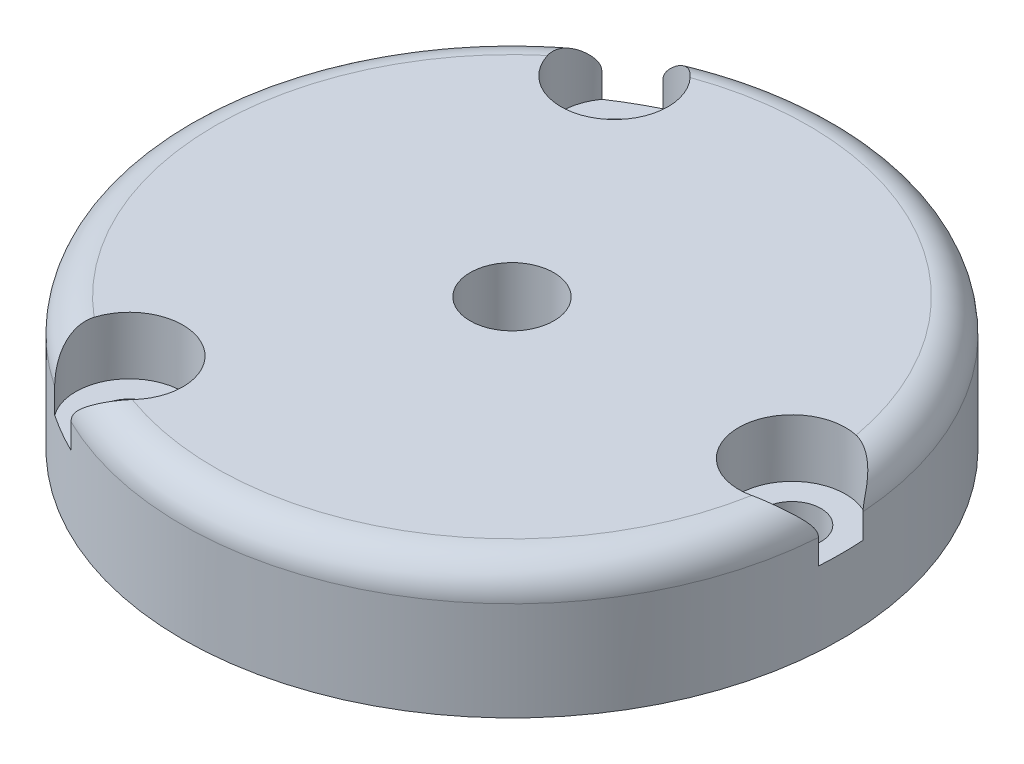
ISO-10303-21;
HEADER;
FILE_DESCRIPTION(('STEP AP214'),'2;1');
FILE_NAME('part.step','',(''),(''),'','','');
FILE_SCHEMA(('AUTOMOTIVE_DESIGN { 1 0 10303 214 1 1 1 1 }'));
ENDSEC;
DATA;
#1=APPLICATION_CONTEXT('core data for automotive mechanical design processes');
#2=APPLICATION_PROTOCOL_DEFINITION('international standard','automotive_design',2000,#1);
#3=PRODUCT_CONTEXT('',#1,'mechanical');
#4=PRODUCT('Part','Part','',(#3));
#5=PRODUCT_RELATED_PRODUCT_CATEGORY('part','',(#4));
#6=PRODUCT_DEFINITION_FORMATION('','',#4);
#7=PRODUCT_DEFINITION_CONTEXT('part definition',#1,'design');
#8=PRODUCT_DEFINITION('design','',#6,#7);
#9=PRODUCT_DEFINITION_SHAPE('','',#8);
#10=(LENGTH_UNIT() NAMED_UNIT(*) SI_UNIT(.MILLI.,.METRE.));
#11=(NAMED_UNIT(*) PLANE_ANGLE_UNIT() SI_UNIT($,.RADIAN.));
#12=(NAMED_UNIT(*) SI_UNIT($,.STERADIAN.) SOLID_ANGLE_UNIT());
#13=UNCERTAINTY_MEASURE_WITH_UNIT(LENGTH_MEASURE(1.E-05),#10,'distance_accuracy_value','');
#14=(GEOMETRIC_REPRESENTATION_CONTEXT(3) GLOBAL_UNCERTAINTY_ASSIGNED_CONTEXT((#13)) GLOBAL_UNIT_ASSIGNED_CONTEXT((#10,
#11,#12)) REPRESENTATION_CONTEXT('',''));
#15=CARTESIAN_POINT('',(0.,0.,0.));
#16=DIRECTION('',(0.,0.,1.));
#17=DIRECTION('',(1.,0.,0.));
#18=AXIS2_PLACEMENT_3D('',#15,#16,#17);
#19=CARTESIAN_POINT('',(17.,8.,0.));
#20=DIRECTION('',(0.,-1.,0.));
#21=DIRECTION('',(0.,0.,-1.));
#22=AXIS2_PLACEMENT_3D('',#19,#20,#21);
#23=CYLINDRICAL_SURFACE('',#22,1.75);
#24=CARTESIAN_POINT('',(17.,0.,0.));
#25=DIRECTION('',(0.,1.,0.));
#26=DIRECTION('',(0.,0.,1.));
#27=AXIS2_PLACEMENT_3D('',#24,#25,#26);
#28=CIRCLE('',#27,1.75);
#29=CARTESIAN_POINT('',(17.,0.,1.75));
#30=VERTEX_POINT('',#29);
#31=EDGE_CURVE('E157',#30,#30,#28,.T.);
#32=ORIENTED_EDGE('',*,*,#31,.F.);
#33=EDGE_LOOP('',(#32));
#34=FACE_BOUND('',#33,.T.);
#35=CARTESIAN_POINT('',(17.,4.5,0.));
#36=DIRECTION('',(0.,1.,0.));
#37=DIRECTION('',(0.,0.,1.));
#38=AXIS2_PLACEMENT_3D('',#35,#36,#37);
#39=CIRCLE('',#38,1.75);
#40=CARTESIAN_POINT('',(17.,4.5,1.75));
#41=VERTEX_POINT('',#40);
#42=EDGE_CURVE('E147',#41,#41,#39,.T.);
#43=ORIENTED_EDGE('',*,*,#42,.T.);
#44=EDGE_LOOP('',(#43));
#45=FACE_BOUND('',#44,.T.);
#46=ADVANCED_FACE('F37',(#34,#45),#23,.F.);
#47=CARTESIAN_POINT('',(-8.50000000000007,8.,14.7224318643354));
#48=DIRECTION('',(0.,-1.,0.));
#49=DIRECTION('',(0.,0.,-1.));
#50=AXIS2_PLACEMENT_3D('',#47,#48,#49);
#51=CYLINDRICAL_SURFACE('',#50,1.75);
#52=CARTESIAN_POINT('',(-8.50000000000007,0.,14.7224318643354));
#53=DIRECTION('',(0.,1.,0.));
#54=DIRECTION('',(0.,0.,1.));
#55=AXIS2_PLACEMENT_3D('',#52,#53,#54);
#56=CIRCLE('',#55,1.75);
#57=CARTESIAN_POINT('',(-8.50000000000007,0.,16.4724318643354));
#58=VERTEX_POINT('',#57);
#59=EDGE_CURVE('E154',#58,#58,#56,.T.);
#60=ORIENTED_EDGE('',*,*,#59,.F.);
#61=EDGE_LOOP('',(#60));
#62=FACE_BOUND('',#61,.T.);
#63=CARTESIAN_POINT('',(-8.50000000000007,4.5,14.7224318643354));
#64=DIRECTION('',(0.,1.,0.));
#65=DIRECTION('',(0.,0.,1.));
#66=AXIS2_PLACEMENT_3D('',#63,#64,#65);
#67=CIRCLE('',#66,1.75);
#68=CARTESIAN_POINT('',(-8.50000000000007,4.5,16.4724318643354));
#69=VERTEX_POINT('',#68);
#70=EDGE_CURVE('E130',#69,#69,#67,.T.);
#71=ORIENTED_EDGE('',*,*,#70,.T.);
#72=EDGE_LOOP('',(#71));
#73=FACE_BOUND('',#72,.T.);
#74=ADVANCED_FACE('F213',(#62,#73),#51,.F.);
#75=CARTESIAN_POINT('',(-8.49999999999986,8.,-14.7224318643355));
#76=DIRECTION('',(0.,-1.,0.));
#77=DIRECTION('',(0.,0.,-1.));
#78=AXIS2_PLACEMENT_3D('',#75,#76,#77);
#79=CYLINDRICAL_SURFACE('',#78,1.75);
#80=CARTESIAN_POINT('',(-8.49999999999986,0.,-14.7224318643355));
#81=DIRECTION('',(0.,1.,0.));
#82=DIRECTION('',(0.,0.,1.));
#83=AXIS2_PLACEMENT_3D('',#80,#81,#82);
#84=CIRCLE('',#83,1.75);
#85=CARTESIAN_POINT('',(-8.49999999999986,0.,-12.9724318643355));
#86=VERTEX_POINT('',#85);
#87=EDGE_CURVE('E151',#86,#86,#84,.T.);
#88=ORIENTED_EDGE('',*,*,#87,.F.);
#89=EDGE_LOOP('',(#88));
#90=FACE_BOUND('',#89,.T.);
#91=CARTESIAN_POINT('',(-8.49999999999986,4.5,-14.7224318643355));
#92=DIRECTION('',(0.,1.,0.));
#93=DIRECTION('',(0.,0.,1.));
#94=AXIS2_PLACEMENT_3D('',#91,#92,#93);
#95=CIRCLE('',#94,1.75);
#96=CARTESIAN_POINT('',(-8.49999999999986,4.5,-12.9724318643355));
#97=VERTEX_POINT('',#96);
#98=EDGE_CURVE('E131',#97,#97,#95,.T.);
#99=ORIENTED_EDGE('',*,*,#98,.T.);
#100=EDGE_LOOP('',(#99));
#101=FACE_BOUND('',#100,.T.);
#102=ADVANCED_FACE('F208',(#90,#101),#79,.F.);
#103=CARTESIAN_POINT('',(0.,8.,0.));
#104=DIRECTION('',(0.,1.,0.));
#105=DIRECTION('',(0.,0.,1.));
#106=AXIS2_PLACEMENT_3D('',#103,#104,#105);
#107=PLANE('',#106);
#108=CARTESIAN_POINT('',(0.,8.,0.));
#109=DIRECTION('',(0.,1.,0.));
#110=DIRECTION('',(0.,0.,1.));
#111=AXIS2_PLACEMENT_3D('',#108,#109,#110);
#112=CIRCLE('',#111,2.54000508001016);
#113=CARTESIAN_POINT('',(0.,8.,2.54000508001016));
#114=VERTEX_POINT('',#113);
#115=EDGE_CURVE('E294',#114,#114,#112,.T.);
#116=ORIENTED_EDGE('',*,*,#115,.F.);
#117=EDGE_LOOP('',(#116));
#118=FACE_BOUND('',#117,.T.);
#119=CARTESIAN_POINT('',(17.,8.,0.));
#120=DIRECTION('',(0.,1.,0.));
#121=DIRECTION('',(0.,0.,1.));
#122=AXIS2_PLACEMENT_3D('',#119,#120,#121);
#123=CIRCLE('',#122,3.25);
#124=CARTESIAN_POINT('',(17.71875,8.,-3.16952653207068));
#125=VERTEX_POINT('',#124);
#126=CARTESIAN_POINT('',(17.71875,8.,3.16952653207068));
#127=VERTEX_POINT('',#126);
#128=EDGE_CURVE('E289',#125,#127,#123,.T.);
#129=ORIENTED_EDGE('',*,*,#128,.F.);
#130=CARTESIAN_POINT('',(0.,8.,0.));
#131=DIRECTION('',(0.,1.,0.));
#132=DIRECTION('',(0.,0.,1.));
#133=AXIS2_PLACEMENT_3D('',#130,#131,#132);
#134=CIRCLE('',#133,18.);
#135=CARTESIAN_POINT('',(-6.11448450525784,8.,-16.9296508893409));
#136=VERTEX_POINT('',#135);
#137=EDGE_CURVE('E185',#125,#136,#134,.T.);
#138=ORIENTED_EDGE('',*,*,#137,.T.);
#139=CARTESIAN_POINT('',(-8.49999999999986,8.,-14.7224318643355));
#140=DIRECTION('',(0.,1.,0.));
#141=DIRECTION('',(0.,0.,1.));
#142=AXIS2_PLACEMENT_3D('',#139,#140,#141);
#143=CIRCLE('',#142,3.25);
#144=CARTESIAN_POINT('',(-11.6042654947419,8.,-13.7601243572703));
#145=VERTEX_POINT('',#144);
#146=EDGE_CURVE('E136',#145,#136,#143,.T.);
#147=ORIENTED_EDGE('',*,*,#146,.F.);
#148=CARTESIAN_POINT('',(0.,8.,0.));
#149=DIRECTION('',(0.,1.,0.));
#150=DIRECTION('',(0.,0.,1.));
#151=AXIS2_PLACEMENT_3D('',#148,#149,#150);
#152=CIRCLE('',#151,18.);
#153=CARTESIAN_POINT('',(-11.6042654947421,8.,13.7601243572701));
#154=VERTEX_POINT('',#153);
#155=EDGE_CURVE('E182',#145,#154,#152,.T.);
#156=ORIENTED_EDGE('',*,*,#155,.T.);
#157=CARTESIAN_POINT('',(-8.50000000000007,8.,14.7224318643354));
#158=DIRECTION('',(0.,1.,0.));
#159=DIRECTION('',(0.,0.,1.));
#160=AXIS2_PLACEMENT_3D('',#157,#158,#159);
#161=CIRCLE('',#160,3.25);
#162=CARTESIAN_POINT('',(-6.11448450525807,8.,16.9296508893408));
#163=VERTEX_POINT('',#162);
#164=EDGE_CURVE('E135',#163,#154,#161,.T.);
#165=ORIENTED_EDGE('',*,*,#164,.F.);
#166=CARTESIAN_POINT('',(0.,8.,0.));
#167=DIRECTION('',(0.,1.,0.));
#168=DIRECTION('',(0.,0.,1.));
#169=AXIS2_PLACEMENT_3D('',#166,#167,#168);
#170=CIRCLE('',#169,18.);
#171=EDGE_CURVE('E179',#163,#127,#170,.T.);
#172=ORIENTED_EDGE('',*,*,#171,.T.);
#173=EDGE_LOOP('',(#129,#138,#147,#156,#165,#172));
#174=FACE_BOUND('',#173,.T.);
#175=ADVANCED_FACE('F212',(#118,#174),#107,.T.);
#176=CARTESIAN_POINT('',(0.,0.,0.));
#177=DIRECTION('',(0.,1.,0.));
#178=DIRECTION('',(0.,0.,1.));
#179=AXIS2_PLACEMENT_3D('',#176,#177,#178);
#180=PLANE('',#179);
#181=CARTESIAN_POINT('',(0.,0.,0.));
#182=DIRECTION('',(0.,1.,0.));
#183=DIRECTION('',(0.,0.,1.));
#184=AXIS2_PLACEMENT_3D('',#181,#182,#183);
#185=CIRCLE('',#184,2.54000508001016);
#186=CARTESIAN_POINT('',(0.,0.,2.54000508001016));
#187=VERTEX_POINT('',#186);
#188=EDGE_CURVE('E140',#187,#187,#185,.T.);
#189=ORIENTED_EDGE('',*,*,#188,.T.);
#190=EDGE_LOOP('',(#189));
#191=FACE_BOUND('',#190,.T.);
#192=CARTESIAN_POINT('',(0.,0.,0.));
#193=DIRECTION('',(0.,1.,0.));
#194=DIRECTION('',(0.,0.,1.));
#195=AXIS2_PLACEMENT_3D('',#192,#193,#194);
#196=CIRCLE('',#195,20.);
#197=CARTESIAN_POINT('',(0.,0.,20.));
#198=VERTEX_POINT('',#197);
#199=EDGE_CURVE('E124',#198,#198,#196,.T.);
#200=ORIENTED_EDGE('',*,*,#199,.F.);
#201=EDGE_LOOP('',(#200));
#202=FACE_BOUND('',#201,.T.);
#203=ORIENTED_EDGE('',*,*,#31,.T.);
#204=EDGE_LOOP('',(#203));
#205=FACE_BOUND('',#204,.T.);
#206=ORIENTED_EDGE('',*,*,#59,.T.);
#207=EDGE_LOOP('',(#206));
#208=FACE_BOUND('',#207,.T.);
#209=ORIENTED_EDGE('',*,*,#87,.T.);
#210=EDGE_LOOP('',(#209));
#211=FACE_BOUND('',#210,.T.);
#212=ADVANCED_FACE('F223',(#191,#202,#205,#208,#211),#180,.F.);
#213=CARTESIAN_POINT('',(0.,8.,0.));
#214=DIRECTION('',(0.,-1.,0.));
#215=DIRECTION('',(0.,0.,-1.));
#216=AXIS2_PLACEMENT_3D('',#213,#214,#215);
#217=CYLINDRICAL_SURFACE('',#216,20.);
#218=DIRECTION('',(0.,1.,0.));
#219=VECTOR('',#218,1.);
#220=CARTESIAN_POINT('',(-8.80352620742625,6.25,-17.9582272598149));
#221=LINE('',#220,#219);
#222=CARTESIAN_POINT('',(-8.80352620742629,4.5,-17.9582272598149));
#223=VERTEX_POINT('',#222);
#224=CARTESIAN_POINT('',(-8.80352620742625,6.,-17.9582272598149));
#225=VERTEX_POINT('',#224);
#226=EDGE_CURVE('E123',#223,#225,#221,.T.);
#227=ORIENTED_EDGE('',*,*,#226,.T.);
#228=CARTESIAN_POINT('',(0.,6.,0.));
#229=DIRECTION('',(0.,1.,0.));
#230=DIRECTION('',(0.,0.,1.));
#231=AXIS2_PLACEMENT_3D('',#228,#229,#230);
#232=CIRCLE('',#231,20.);
#233=CARTESIAN_POINT('',(19.9540441176471,6.,-1.355036291394));
#234=VERTEX_POINT('',#233);
#235=EDGE_CURVE('E58',#225,#234,#232,.F.);
#236=ORIENTED_EDGE('',*,*,#235,.T.);
#237=DIRECTION('',(0.,1.,0.));
#238=VECTOR('',#237,1.);
#239=CARTESIAN_POINT('',(19.9540441176471,6.25,-1.355036291394));
#240=LINE('',#239,#238);
#241=CARTESIAN_POINT('',(19.9540441176471,4.5,-1.355036291394));
#242=VERTEX_POINT('',#241);
#243=EDGE_CURVE('E174',#234,#242,#240,.F.);
#244=ORIENTED_EDGE('',*,*,#243,.T.);
#245=CARTESIAN_POINT('',(0.,4.5,0.));
#246=DIRECTION('',(0.,1.,0.));
#247=DIRECTION('',(0.,0.,1.));
#248=AXIS2_PLACEMENT_3D('',#245,#246,#247);
#249=CIRCLE('',#248,20.);
#250=CARTESIAN_POINT('',(19.9540441176471,4.5,1.355036291394));
#251=VERTEX_POINT('',#250);
#252=EDGE_CURVE('E148',#251,#242,#249,.T.);
#253=ORIENTED_EDGE('',*,*,#252,.F.);
#254=DIRECTION('',(0.,1.,0.));
#255=VECTOR('',#254,1.);
#256=CARTESIAN_POINT('',(19.9540441176471,6.25,1.355036291394));
#257=LINE('',#256,#255);
#258=CARTESIAN_POINT('',(19.9540441176471,6.,1.355036291394));
#259=VERTEX_POINT('',#258);
#260=EDGE_CURVE('E176',#251,#259,#257,.T.);
#261=ORIENTED_EDGE('',*,*,#260,.T.);
#262=CARTESIAN_POINT('',(0.,6.,0.));
#263=DIRECTION('',(0.,1.,0.));
#264=DIRECTION('',(0.,0.,1.));
#265=AXIS2_PLACEMENT_3D('',#262,#263,#264);
#266=CIRCLE('',#265,20.);
#267=CARTESIAN_POINT('',(-8.8035262074265,6.,17.9582272598148));
#268=VERTEX_POINT('',#267);
#269=EDGE_CURVE('E284',#259,#268,#266,.F.);
#270=ORIENTED_EDGE('',*,*,#269,.T.);
#271=DIRECTION('',(0.,1.,0.));
#272=VECTOR('',#271,1.);
#273=CARTESIAN_POINT('',(-8.8035262074265,6.25,17.9582272598148));
#274=LINE('',#273,#272);
#275=CARTESIAN_POINT('',(-8.80352620742653,4.5,17.9582272598148));
#276=VERTEX_POINT('',#275);
#277=EDGE_CURVE('E170',#268,#276,#274,.F.);
#278=ORIENTED_EDGE('',*,*,#277,.T.);
#279=CARTESIAN_POINT('',(0.,4.5,0.));
#280=DIRECTION('',(0.,1.,0.));
#281=DIRECTION('',(0.,0.,1.));
#282=AXIS2_PLACEMENT_3D('',#279,#280,#281);
#283=CIRCLE('',#282,20.);
#284=CARTESIAN_POINT('',(-11.1505179102207,4.5,16.6031909684207));
#285=VERTEX_POINT('',#284);
#286=EDGE_CURVE('E144',#285,#276,#283,.T.);
#287=ORIENTED_EDGE('',*,*,#286,.F.);
#288=DIRECTION('',(0.,1.,0.));
#289=VECTOR('',#288,1.);
#290=CARTESIAN_POINT('',(-11.1505179102207,6.25,16.6031909684207));
#291=LINE('',#290,#289);
#292=CARTESIAN_POINT('',(-11.1505179102207,6.,16.6031909684207));
#293=VERTEX_POINT('',#292);
#294=EDGE_CURVE('E172',#285,#293,#291,.T.);
#295=ORIENTED_EDGE('',*,*,#294,.T.);
#296=CARTESIAN_POINT('',(0.,6.,0.));
#297=DIRECTION('',(0.,1.,0.));
#298=DIRECTION('',(0.,0.,1.));
#299=AXIS2_PLACEMENT_3D('',#296,#297,#298);
#300=CIRCLE('',#299,20.);
#301=CARTESIAN_POINT('',(-11.1505179102205,6.,-16.6031909684209));
#302=VERTEX_POINT('',#301);
#303=EDGE_CURVE('E119',#293,#302,#300,.F.);
#304=ORIENTED_EDGE('',*,*,#303,.T.);
#305=DIRECTION('',(0.,1.,0.));
#306=VECTOR('',#305,1.);
#307=CARTESIAN_POINT('',(-11.1505179102205,6.25,-16.6031909684209));
#308=LINE('',#307,#306);
#309=CARTESIAN_POINT('',(-11.1505179102204,4.5,-16.6031909684209));
#310=VERTEX_POINT('',#309);
#311=EDGE_CURVE('E113',#302,#310,#308,.F.);
#312=ORIENTED_EDGE('',*,*,#311,.T.);
#313=CARTESIAN_POINT('',(0.,4.5,0.));
#314=DIRECTION('',(0.,1.,0.));
#315=DIRECTION('',(0.,0.,1.));
#316=AXIS2_PLACEMENT_3D('',#313,#314,#315);
#317=CIRCLE('',#316,20.);
#318=EDGE_CURVE('E117',#223,#310,#317,.T.);
#319=ORIENTED_EDGE('',*,*,#318,.F.);
#320=EDGE_LOOP('',(#227,#236,#244,#253,#261,#270,#278,#287,#295,#304,#312,#319));
#321=FACE_BOUND('',#320,.T.);
#322=ORIENTED_EDGE('',*,*,#199,.T.);
#323=EDGE_LOOP('',(#322));
#324=FACE_BOUND('',#323,.T.);
#325=ADVANCED_FACE('F115',(#321,#324),#217,.T.);
#326=CARTESIAN_POINT('',(-8.49999999999986,4.5,-14.7224318643355));
#327=DIRECTION('',(0.,1.,0.));
#328=DIRECTION('',(0.,0.,1.));
#329=AXIS2_PLACEMENT_3D('',#326,#327,#328);
#330=CYLINDRICAL_SURFACE('',#329,3.25);
#331=ORIENTED_EDGE('',*,*,#146,.T.);
#332=CARTESIAN_POINT('',(-6.11448450525784,8.,-16.9296508893409));
#333=CARTESIAN_POINT('',(-6.15699882348261,8.00000484261255,-16.9756200424879));
#334=CARTESIAN_POINT('',(-6.20083787973819,7.99750590883581,-17.0203162114791));
#335=CARTESIAN_POINT('',(-6.290693527046,7.98789505230279,-17.106823781387));
#336=CARTESIAN_POINT('',(-6.33670721054258,7.98078913604264,-17.1486388601942));
#337=CARTESIAN_POINT('',(-6.43011653692011,7.96244258226751,-17.2287920518186));
#338=CARTESIAN_POINT('',(-6.47749534588452,7.95124101600859,-17.2671588862103));
#339=CARTESIAN_POINT('',(-6.57366437807587,7.92507757002663,-17.3407137013072));
#340=CARTESIAN_POINT('',(-6.62245504937324,7.91011448470045,-17.3759006579058));
#341=CARTESIAN_POINT('',(-6.76986429717374,7.86031380418753,-17.4761890982992));
#342=CARTESIAN_POINT('',(-6.87009422901719,7.82044463271987,-17.5365054921736));
#343=CARTESIAN_POINT('',(-7.0727032534655,7.72958423597335,-17.6445166335825));
#344=CARTESIAN_POINT('',(-7.17508910738692,7.67855099576568,-17.6921621526548));
#345=CARTESIAN_POINT('',(-7.35316086373035,7.58168484201379,-17.7644625216368));
#346=CARTESIAN_POINT('',(-7.42888773825527,7.53793337774414,-17.7918754476863));
#347=CARTESIAN_POINT('',(-7.57955524611685,7.44581092366916,-17.8403706559995));
#348=CARTESIAN_POINT('',(-7.65449585724778,7.39743980378281,-17.8614527599294));
#349=CARTESIAN_POINT('',(-7.8026673059529,7.29642967362192,-17.8976531659144));
#350=CARTESIAN_POINT('',(-7.87590148805815,7.24380011110484,-17.9127842559254));
#351=CARTESIAN_POINT('',(-8.01990922956972,7.13415495655745,-17.9376056835353));
#352=CARTESIAN_POINT('',(-8.09068420457608,7.07714195060971,-17.9472992015326));
#353=CARTESIAN_POINT('',(-8.22247737594965,6.96352378508904,-17.9611773741577));
#354=CARTESIAN_POINT('',(-8.28380489145138,6.9073284709651,-17.9657734058851));
#355=CARTESIAN_POINT('',(-8.40219794447938,6.78985326947604,-17.9715017221832));
#356=CARTESIAN_POINT('',(-8.45924284226875,6.72855143146289,-17.9726181674804));
#357=CARTESIAN_POINT('',(-8.56703104626147,6.59864446116617,-17.9721924772886));
#358=CARTESIAN_POINT('',(-8.61764096106961,6.52992683151221,-17.9706016480474));
#359=CARTESIAN_POINT('',(-8.70503882234152,6.38476159979072,-17.9662477762792));
#360=CARTESIAN_POINT('',(-8.74200673219111,6.30843287434533,-17.9635011015706));
#361=CARTESIAN_POINT('',(-8.77875950046583,6.1916964543393,-17.9604786249124));
#362=CARTESIAN_POINT('',(-8.78783443182771,6.15429498707123,-17.9596710576745));
#363=CARTESIAN_POINT('',(-8.80031467585149,6.07798407088327,-17.958528734799));
#364=CARTESIAN_POINT('',(-8.8036314203065,6.03906032366693,-17.9582013770164));
#365=CARTESIAN_POINT('',(-8.8035262074263,6.00000000000001,-17.9582272598149));
#366=B_SPLINE_CURVE_WITH_KNOTS('',3,(#332,#333,#334,#335,#336,#337,#338,#339,#340,#341,#342,
#343,#344,#345,#346,#347,#348,#349,#350,#351,#352,#353,#354,#355,#356,#357,#358,#359,#360,#361,
#362,#363,#364,#365),.UNSPECIFIED.,.F.,.F.,(4,2,2,2,2,2,2,2,2,2,2,2,2,2,2,2,4),(0.,
0.187716893140828,0.375189535404724,0.560918516995513,0.746707102581722,1.11602247485986,
1.48675240353006,1.76137650659081,2.03600834484391,2.31004676767369,2.58392473975247,
2.83358149478124,3.08437305387976,3.339723237398,3.59157304126216,3.70663678102346,
3.82345516605381),.UNSPECIFIED.);
#367=EDGE_CURVE('E195',#136,#225,#366,.T.);
#368=ORIENTED_EDGE('',*,*,#367,.T.);
#369=ORIENTED_EDGE('',*,*,#226,.F.);
#370=CARTESIAN_POINT('',(-8.49999999999986,4.5,-14.7224318643355));
#371=DIRECTION('',(0.,1.,0.));
#372=DIRECTION('',(0.,0.,1.));
#373=AXIS2_PLACEMENT_3D('',#370,#371,#372);
#374=CIRCLE('',#373,3.25);
#375=EDGE_CURVE('E128',#310,#223,#374,.T.);
#376=ORIENTED_EDGE('',*,*,#375,.F.);
#377=ORIENTED_EDGE('',*,*,#311,.F.);
#378=CARTESIAN_POINT('',(-11.1505179102205,6.,-16.6031909684209));
#379=CARTESIAN_POINT('',(-11.1505050934058,6.02492929659843,-16.6032044441042));
#380=CARTESIAN_POINT('',(-11.151279747837,6.04983720432489,-16.6021176128663));
#381=CARTESIAN_POINT('',(-11.1542890987654,6.09932534005669,-16.5978678440573));
#382=CARTESIAN_POINT('',(-11.1565201220951,6.12390623411145,-16.5947101294529));
#383=CARTESIAN_POINT('',(-11.1651176787302,6.19595907175415,-16.582471317922));
#384=CARTESIAN_POINT('',(-11.1733981212049,6.24274136754481,-16.5706139892433));
#385=CARTESIAN_POINT('',(-11.1977899660719,6.35229608748673,-16.5349029776859));
#386=CARTESIAN_POINT('',(-11.2157251717002,6.41364604431599,-16.5081128146204));
#387=CARTESIAN_POINT('',(-11.2552575779048,6.53149343981492,-16.4465013380529));
#388=CARTESIAN_POINT('',(-11.2768912749889,6.58793312037043,-16.4115985989887));
#389=CARTESIAN_POINT('',(-11.3221091234332,6.6982223573264,-16.3349612169418));
#390=CARTESIAN_POINT('',(-11.3457345337471,6.7519192446236,-16.2930350810104));
#391=CARTESIAN_POINT('',(-11.3927772001851,6.85555265251558,-16.2046114918485));
#392=CARTESIAN_POINT('',(-11.4161942269991,6.90548539647193,-16.1581095526582));
#393=CARTESIAN_POINT('',(-11.4618361748921,7.00208235320234,-16.0614178661044));
#394=CARTESIAN_POINT('',(-11.4840624418323,7.04875027512244,-16.0112324409211));
#395=CARTESIAN_POINT('',(-11.52671744246,7.13922910513513,-15.9076008084646));
#396=CARTESIAN_POINT('',(-11.547145503777,7.1830389429844,-15.8541533940372));
#397=CARTESIAN_POINT('',(-11.5880776138388,7.27315865623425,-15.737588950941));
#398=CARTESIAN_POINT('',(-11.6082824419585,7.31911405502278,-15.6740908223162));
#399=CARTESIAN_POINT('',(-11.6452327723617,7.40759238097912,-15.5437781160828));
#400=CARTESIAN_POINT('',(-11.6619770351453,7.45011407495687,-15.4769623607627));
#401=CARTESIAN_POINT('',(-11.7062244642747,7.57225482150819,-15.2720591267496));
#402=CARTESIAN_POINT('',(-11.7278053543829,7.64658255070631,-15.1293427703397));
#403=CARTESIAN_POINT('',(-11.7493651203146,7.76633725273157,-14.8604197304792));
#404=CARTESIAN_POINT('',(-11.7524639047658,7.81454566787368,-14.7356956637782));
#405=CARTESIAN_POINT('',(-11.7435725689047,7.89624557549767,-14.4822084064394));
#406=CARTESIAN_POINT('',(-11.731629655675,7.92978266842538,-14.3534590831014));
#407=CARTESIAN_POINT('',(-11.6995687347496,7.96894945515086,-14.1467336098454));
#408=CARTESIAN_POINT('',(-11.684623178503,7.9803756521373,-14.069023204838));
#409=CARTESIAN_POINT('',(-11.6488587214776,7.99591413275276,-13.9139898705489));
#410=CARTESIAN_POINT('',(-11.6280222586545,8.00000427412684,-13.8366688143974));
#411=CARTESIAN_POINT('',(-11.6042654947419,8.,-13.7601243572703));
#412=B_SPLINE_CURVE_WITH_KNOTS('',3,(#378,#379,#380,#381,#382,#383,#384,#385,#386,#387,#388,
#389,#390,#391,#392,#393,#394,#395,#396,#397,#398,#399,#400,#401,#402,#403,#404,#405,#406,#407,
#408,#409,#410,#411),.UNSPECIFIED.,.F.,.F.,(4,2,2,2,2,2,2,2,2,2,2,2,2,2,2,2,4),(0.,
0.0747154672597263,0.149243215898002,0.295352248182606,0.502104778501227,0.711029652663072,
0.92703717282417,1.14325861009584,1.35923027018543,1.57528234463184,1.81788746658455,
2.06057933443399,2.54528812899128,2.94515663709156,3.34377331346008,3.58313341974195,
3.82321477330427),.UNSPECIFIED.);
#413=EDGE_CURVE('E188',#302,#145,#412,.T.);
#414=ORIENTED_EDGE('',*,*,#413,.T.);
#415=EDGE_LOOP('',(#331,#368,#369,#376,#377,#414));
#416=FACE_BOUND('',#415,.T.);
#417=ADVANCED_FACE('F134',(#416),#330,.F.);
#418=CARTESIAN_POINT('',(-8.49999999999986,4.5,-14.7224318643355));
#419=DIRECTION('',(0.,1.,0.));
#420=DIRECTION('',(0.,0.,1.));
#421=AXIS2_PLACEMENT_3D('',#418,#419,#420);
#422=PLANE('',#421);
#423=ORIENTED_EDGE('',*,*,#98,.F.);
#424=EDGE_LOOP('',(#423));
#425=FACE_BOUND('',#424,.T.);
#426=ORIENTED_EDGE('',*,*,#318,.T.);
#427=ORIENTED_EDGE('',*,*,#375,.T.);
#428=EDGE_LOOP('',(#426,#427));
#429=FACE_BOUND('',#428,.T.);
#430=ADVANCED_FACE('F127',(#425,#429),#422,.T.);
#431=CARTESIAN_POINT('',(-8.50000000000007,4.5,14.7224318643354));
#432=DIRECTION('',(0.,1.,0.));
#433=DIRECTION('',(0.,0.,1.));
#434=AXIS2_PLACEMENT_3D('',#431,#432,#433);
#435=CYLINDRICAL_SURFACE('',#434,3.25);
#436=ORIENTED_EDGE('',*,*,#164,.T.);
#437=CARTESIAN_POINT('',(-11.6042654947421,8.,13.7601243572701));
#438=CARTESIAN_POINT('',(-11.6228187900454,8.00000484261255,13.8199274134509));
#439=CARTESIAN_POINT('',(-11.6396072797159,7.99750590883581,13.8802412343417));
#440=CARTESIAN_POINT('',(-11.6695972092218,7.98789505230279,14.0013122925377));
#441=CARTESIAN_POINT('',(-11.6828032879818,7.98078913604264,14.0620688507711));
#442=CARTESIAN_POINT('',(-11.7055133249342,7.9624425822675,14.1830402961766));
#443=CARTESIAN_POINT('',(-11.715050573698,7.95124101600859,14.2432549655367));
#444=CARTESIAN_POINT('',(-11.7306663960469,7.92507757002663,14.3633171980202));
#445=CARTESIAN_POINT('',(-11.7367438586945,7.91011448470045,14.4231646371307));
#446=CARTESIAN_POINT('',(-11.7498915718809,7.86031380418753,14.6009690106754));
#447=CARTESIAN_POINT('',(-11.752012135319,7.82044463271987,14.7179288748086));
#448=CARTESIAN_POINT('',(-11.7442480154467,7.72958423597335,14.9473990077213));
#449=CARTESIAN_POINT('',(-11.7343173183791,7.67855099576568,15.0598905177415));
#450=CARTESIAN_POINT('',(-11.7078953964488,7.58168484201379,15.2502553669225));
#451=CARTESIAN_POINT('',(-11.6937722495373,7.53793337774413,15.329543227035));
#452=CARTESIAN_POINT('',(-11.6604365779675,7.44581092366916,15.4842727205246));
#453=CARTESIAN_POINT('',(-11.6412239099706,7.39743980378281,15.5597142455041));
#454=CARTESIAN_POINT('',(-11.5984886568283,7.29642967362191,15.7061346871908));
#455=CARTESIAN_POINT('',(-11.5749754741122,7.24380011110484,15.7771228943248));
#456=CARTESIAN_POINT('',(-11.5244675902248,7.13415495655744,15.9142479706204));
#457=CARTESIAN_POINT('',(-11.4974749355593,7.07714195060971,15.9803876559267));
#458=CARTESIAN_POINT('',(-11.4435971999239,6.96352378508903,16.1014629766941));
#459=CARTESIAN_POINT('',(-11.4169137224056,6.90732847096509,16.1568721789333));
#460=CARTESIAN_POINT('',(-11.3626780633267,6.78985326947603,16.2622677286362));
#461=CARTESIAN_POINT('',(-11.3351224844213,6.72855143146289,16.3122282819267));
#462=CARTESIAN_POINT('',(-11.2808597239047,6.59864446116616,16.4053627597168));
#463=CARTESIAN_POINT('',(-11.2541770679647,6.52992683151221,16.4483968170034));
#464=CARTESIAN_POINT('',(-11.2067075737726,6.38476159979072,16.5219086492172));
#465=CARTESIAN_POINT('',(-11.1858449287743,6.30843287434532,16.5525504609175));
#466=CARTESIAN_POINT('',(-11.1648510030686,6.19169645433929,16.5828680535737));
#467=CARTESIAN_POINT('',(-11.1596141636443,6.15429498707122,16.5903233910517));
#468=CARTESIAN_POINT('',(-11.1523847610029,6.07798407088326,16.600560437984));
#469=CARTESIAN_POINT('',(-11.1504428886195,6.03906032366693,16.6032691440485));
#470=CARTESIAN_POINT('',(-11.1505179102207,6.00000000000001,16.6031909684207));
#471=B_SPLINE_CURVE_WITH_KNOTS('',3,(#437,#438,#439,#440,#441,#442,#443,#444,#445,#446,#447,
#448,#449,#450,#451,#452,#453,#454,#455,#456,#457,#458,#459,#460,#461,#462,#463,#464,#465,#466,
#467,#468,#469,#470),.UNSPECIFIED.,.F.,.F.,(4,2,2,2,2,2,2,2,2,2,2,2,2,2,2,2,4),(0.,
0.187716893140829,0.375189535404727,0.560918516995517,0.746707102581725,1.11602247485986,
1.48675240353006,1.76137650659081,2.03600834484391,2.31004676767369,2.58392473975247,
2.83358149478124,3.08437305387975,3.339723237398,3.59157304126216,3.70663678102346,
3.82345516605381),.UNSPECIFIED.);
#472=EDGE_CURVE('E11',#154,#293,#471,.T.);
#473=ORIENTED_EDGE('',*,*,#472,.T.);
#474=ORIENTED_EDGE('',*,*,#294,.F.);
#475=CARTESIAN_POINT('',(-8.50000000000007,4.5,14.7224318643354));
#476=DIRECTION('',(0.,1.,0.));
#477=DIRECTION('',(0.,0.,1.));
#478=AXIS2_PLACEMENT_3D('',#475,#476,#477);
#479=CIRCLE('',#478,3.25);
#480=EDGE_CURVE('E138',#276,#285,#479,.T.);
#481=ORIENTED_EDGE('',*,*,#480,.F.);
#482=ORIENTED_EDGE('',*,*,#277,.F.);
#483=CARTESIAN_POINT('',(-8.80352620742651,6.,17.9582272598148));
#484=CARTESIAN_POINT('',(-8.80354428611789,6.02492929659843,17.9582228979694));
#485=CARTESIAN_POINT('',(-8.80221573544073,6.0498372043249,17.958350352767));
#486=CARTESIAN_POINT('',(-8.79703065222768,6.09932534005669,17.9588316427154));
#487=CARTESIAN_POINT('',(-8.79318047949753,6.12390623411145,17.9591849082931));
#488=CARTESIAN_POINT('',(-8.77828257948209,6.19595907175415,17.9605112049841));
#489=CARTESIAN_POINT('',(-8.76387361038801,6.24274136754482,17.9617536141824));
#490=CARTESIAN_POINT('',(-8.72075104475086,6.35229608748674,17.9650220657038));
#491=CARTESIAN_POINT('',(-8.68858248015047,6.41364604431599,17.9671593278672));
#492=CARTESIAN_POINT('',(-8.61545917317613,6.53149343981493,17.9705896576294));
#493=CARTESIAN_POINT('',(-8.57441566594276,6.58793312037043,17.9718736193499));
#494=CARTESIAN_POINT('',(-8.48543682198845,6.6982223573264,17.9727147337837));
#495=CARTESIAN_POINT('',(-8.43731501803235,6.7519192446236,17.9722118713246));
#496=CARTESIAN_POINT('',(-8.33721661030537,6.85555265251558,17.9687402209408));
#497=CARTESIAN_POINT('',(-8.28523623623436,6.90548539647193,17.9657689914476));
#498=CARTESIAN_POINT('',(-8.17867780539749,7.00208235320234,17.9569502345242));
#499=CARTESIAN_POINT('',(-8.12410281881891,7.04875027512243,17.9511060337341));
#500=CARTESIAN_POINT('',(-8.01302769216209,7.13922910513513,17.9362305316479));
#501=CARTESIAN_POINT('',(-7.95652684284294,7.1830389429844,17.9271980444848));
#502=CARTESIAN_POINT('',(-7.83511301891268,7.27315865623425,17.9043640700807));
#503=CARTESIAN_POINT('',(-7.77001961237098,7.31911405502278,17.8901129001991));
#504=CARTESIAN_POINT('',(-7.63869033313537,7.40759238097912,17.8569564718897));
#505=CARTESIAN_POINT('',(-7.57245406026336,7.45011407495687,17.8380495511679));
#506=CARTESIAN_POINT('',(-7.37287893972569,7.57225482150819,17.7739173318396));
#507=CARTESIAN_POINT('',(-7.23849250448508,7.64658255070632,17.7212487527047));
#508=CARTESIAN_POINT('',(-6.99481843733712,7.76633725273157,17.605458537771));
#509=CARTESIAN_POINT('',(-6.88525483488513,7.81454566787367,17.545780130476));
#510=CARTESIAN_POINT('',(-6.6701740984246,7.89624557549767,17.4113363790773));
#511=CARTESIAN_POINT('',(-6.56464537030876,7.92978266842538,17.3366188511562));
#512=CARTESIAN_POINT('',(-6.40164631932237,7.96894945515086,17.205490542538));
#513=CARTESIAN_POINT('',(-6.34181991257087,7.98037565213729,17.153692108651));
#514=CARTESIAN_POINT('',(-6.22543933515577,7.99591413275276,17.04520251317));
#515=CARTESIAN_POINT('',(-6.16889556769274,8.00000427412684,16.9884970789644));
#516=CARTESIAN_POINT('',(-6.11448450525807,8.,16.9296508893408));
#517=B_SPLINE_CURVE_WITH_KNOTS('',3,(#483,#484,#485,#486,#487,#488,#489,#490,#491,#492,#493,
#494,#495,#496,#497,#498,#499,#500,#501,#502,#503,#504,#505,#506,#507,#508,#509,#510,#511,#512,
#513,#514,#515,#516),.UNSPECIFIED.,.F.,.F.,(4,2,2,2,2,2,2,2,2,2,2,2,2,2,2,2,4),(0.,
0.0747154672597275,0.149243215898003,0.295352248182611,0.502104778501234,0.711029652663078,
0.927037172824171,1.14325861009584,1.35923027018543,1.57528234463184,1.81788746658455,
2.06057933443399,2.54528812899128,2.94515663709156,3.34377331346007,3.58313341974194,
3.82321477330427),.UNSPECIFIED.);
#518=EDGE_CURVE('E51',#268,#163,#517,.T.);
#519=ORIENTED_EDGE('',*,*,#518,.T.);
#520=EDGE_LOOP('',(#436,#473,#474,#481,#482,#519));
#521=FACE_BOUND('',#520,.T.);
#522=ADVANCED_FACE('F264',(#521),#435,.F.);
#523=CARTESIAN_POINT('',(-8.50000000000007,4.5,14.7224318643354));
#524=DIRECTION('',(0.,1.,0.));
#525=DIRECTION('',(0.,0.,1.));
#526=AXIS2_PLACEMENT_3D('',#523,#524,#525);
#527=PLANE('',#526);
#528=ORIENTED_EDGE('',*,*,#70,.F.);
#529=EDGE_LOOP('',(#528));
#530=FACE_BOUND('',#529,.T.);
#531=ORIENTED_EDGE('',*,*,#286,.T.);
#532=ORIENTED_EDGE('',*,*,#480,.T.);
#533=EDGE_LOOP('',(#531,#532));
#534=FACE_BOUND('',#533,.T.);
#535=ADVANCED_FACE('F259',(#530,#534),#527,.T.);
#536=CARTESIAN_POINT('',(17.,4.5,0.));
#537=DIRECTION('',(0.,1.,0.));
#538=DIRECTION('',(0.,0.,1.));
#539=AXIS2_PLACEMENT_3D('',#536,#537,#538);
#540=CYLINDRICAL_SURFACE('',#539,3.25);
#541=ORIENTED_EDGE('',*,*,#243,.F.);
#542=CARTESIAN_POINT('',(19.9540441176471,6.,-1.355036291394));
#543=CARTESIAN_POINT('',(19.9540493795238,6.02492929659842,-1.35501845386531));
#544=CARTESIAN_POINT('',(19.9534954832778,6.04983720432489,-1.35623273990075));
#545=CARTESIAN_POINT('',(19.9513197509932,6.09932534005669,-1.3609637986582));
#546=CARTESIAN_POINT('',(19.9497006015927,6.12390623411144,-1.36447477884033));
#547=CARTESIAN_POINT('',(19.9434002582123,6.19595907175414,-1.37803988706224));
#548=CARTESIAN_POINT('',(19.937271731593,6.24274136754481,-1.39113962493922));
#549=CARTESIAN_POINT('',(19.9185410108229,6.35229608748673,-1.43011908801801));
#550=CARTESIAN_POINT('',(19.9043076518508,6.41364604431598,-1.45904651324695));
#551=CARTESIAN_POINT('',(19.870716751081,6.53149343981492,-1.52408831957655));
#552=CARTESIAN_POINT('',(19.8513069409317,6.58793312037042,-1.5602750203613));
#553=CARTESIAN_POINT('',(19.8075459454218,6.69822235732639,-1.63775351684201));
#554=CARTESIAN_POINT('',(19.7830495517796,6.75191924462359,-1.67917679031441));
#555=CARTESIAN_POINT('',(19.7299938104906,6.85555265251557,-1.76412872909241));
#556=CARTESIAN_POINT('',(19.7014304632335,6.90548539647192,-1.80765943878954));
#557=CARTESIAN_POINT('',(19.6405139802896,7.00208235320233,-1.89553236841999));
#558=CARTESIAN_POINT('',(19.6081652606513,7.04875027512243,-1.93987359281319));
#559=CARTESIAN_POINT('',(19.5397451346222,7.13922910513512,-2.02862972318346));
#560=CARTESIAN_POINT('',(19.50367234662,7.1830389429844,-2.07304465044769));
#561=CARTESIAN_POINT('',(19.4231906327516,7.27315865623424,-2.16677511913986));
#562=CARTESIAN_POINT('',(19.3783020543296,7.31911405502278,-2.21602207788304));
#563=CARTESIAN_POINT('',(19.2839231054971,7.40759238097912,-2.3131783558071));
#564=CARTESIAN_POINT('',(19.2344310954087,7.45011407495687,-2.36108719040534));
#565=CARTESIAN_POINT('',(19.0791034040004,7.57225482150819,-2.50185820509013));
#566=CARTESIAN_POINT('',(18.9662978588681,7.64658255070632,-2.59190598236509));
#567=CARTESIAN_POINT('',(18.7441835576518,7.76633725273157,-2.74503880729184));
#568=CARTESIAN_POINT('',(18.637718739651,7.81454566787368,-2.81008446669791));
#569=CARTESIAN_POINT('',(18.4137466673294,7.89624557549767,-2.92912797263805));
#570=CARTESIAN_POINT('',(18.2962750259838,7.92978266842538,-2.98315976805489));
#571=CARTESIAN_POINT('',(18.101215054072,7.96894945515087,-3.05875693269276));
#572=CARTESIAN_POINT('',(18.0264430910739,7.9803756521373,-3.08466890381322));
#573=CARTESIAN_POINT('',(17.8742980566334,7.99591413275276,-3.13121264262127));
#574=CARTESIAN_POINT('',(17.7969178263472,8.00000427412685,-3.15182826456713));
#575=CARTESIAN_POINT('',(17.71875,8.,-3.16952653207068));
#576=B_SPLINE_CURVE_WITH_KNOTS('',3,(#542,#543,#544,#545,#546,#547,#548,#549,#550,#551,#552,
#553,#554,#555,#556,#557,#558,#559,#560,#561,#562,#563,#564,#565,#566,#567,#568,#569,#570,#571,
#572,#573,#574,#575),.UNSPECIFIED.,.F.,.F.,(4,2,2,2,2,2,2,2,2,2,2,2,2,2,2,2,4),(0.,
0.0747154672597228,0.149243215897999,0.295352248182607,0.502104778501227,0.71102965266307,
0.927037172824163,1.14325861009584,1.35923027018543,1.57528234463185,1.81788746658455,
2.060579334434,2.54528812899129,2.94515663709157,3.34377331346009,3.58313341974196,
3.82321477330428),.UNSPECIFIED.);
#577=EDGE_CURVE('E236',#234,#125,#576,.T.);
#578=ORIENTED_EDGE('',*,*,#577,.T.);
#579=ORIENTED_EDGE('',*,*,#128,.T.);
#580=CARTESIAN_POINT('',(17.71875,8.,3.16952653207068));
#581=CARTESIAN_POINT('',(17.7798176135282,8.00000484261255,3.15569262903696));
#582=CARTESIAN_POINT('',(17.8404451594542,7.99750590883581,3.1400749771373));
#583=CARTESIAN_POINT('',(17.9602907362679,7.98789505230279,3.10551148884915));
#584=CARTESIAN_POINT('',(18.0195104985245,7.98078913604264,3.08657000942303));
#585=CARTESIAN_POINT('',(18.1356298618544,7.9624425822675,3.04575175564188));
#586=CARTESIAN_POINT('',(18.1925459195827,7.95124101600859,3.02390392067353));
#587=CARTESIAN_POINT('',(18.3043307741229,7.92507757002663,2.9773965032869));
#588=CARTESIAN_POINT('',(18.3591989080678,7.91011448470045,2.95273602077498));
#589=CARTESIAN_POINT('',(18.5197558690547,7.86031380418753,2.87522008762369));
#590=CARTESIAN_POINT('',(18.6221063643363,7.82044463271987,2.81857661736487));
#591=CARTESIAN_POINT('',(18.8169512689123,7.72958423597335,2.69711762586108));
#592=CARTESIAN_POINT('',(18.9094064257661,7.67855099576568,2.63227163491311));
#593=CARTESIAN_POINT('',(19.0610562601792,7.58168484201379,2.51420715471421));
#594=CARTESIAN_POINT('',(19.1226599877926,7.53793337774414,2.46233222065118));
#595=CARTESIAN_POINT('',(19.2399918240844,7.44581092366916,2.35609793547474));
#596=CARTESIAN_POINT('',(19.2957197672185,7.39743980378281,2.30173851442521));
#597=CARTESIAN_POINT('',(19.4011559627813,7.29642967362191,2.19151847872353));
#598=CARTESIAN_POINT('',(19.4508769621704,7.24380011110484,2.13566136160049));
#599=CARTESIAN_POINT('',(19.5443768197946,7.13415495655744,2.02335771291481));
#600=CARTESIAN_POINT('',(19.5881591401354,7.07714195060971,1.96691154560572));
#601=CARTESIAN_POINT('',(19.6660745758737,6.96352378508903,1.85971439746344));
#602=CARTESIAN_POINT('',(19.7007186138571,6.90732847096509,1.80890122695168));
#603=CARTESIAN_POINT('',(19.7648760078062,6.78985326947604,1.70923399354689));
#604=CARTESIAN_POINT('',(19.7943653266901,6.7285514314629,1.66038988555358));
#605=CARTESIAN_POINT('',(19.8478907701662,6.59864446116618,1.56682971757169));
#606=CARTESIAN_POINT('',(19.8718180290344,6.52992683151222,1.5222048310439));
#607=CARTESIAN_POINT('',(19.9117463961142,6.38476159979073,1.44433912706187));
#608=CARTESIAN_POINT('',(19.9278516609655,6.30843287434534,1.41095064065305));
#609=CARTESIAN_POINT('',(19.9436105035345,6.19169645433931,1.37761057133863));
#610=CARTESIAN_POINT('',(19.9474485954721,6.15429498707123,1.36934766662266));
#611=CARTESIAN_POINT('',(19.9526994368545,6.07798407088326,1.3579682968149));
#612=CARTESIAN_POINT('',(19.9540743089261,6.03906032366692,1.35493223296769));
#613=CARTESIAN_POINT('',(19.9540441176471,6.,1.355036291394));
#614=B_SPLINE_CURVE_WITH_KNOTS('',3,(#580,#581,#582,#583,#584,#585,#586,#587,#588,#589,#590,
#591,#592,#593,#594,#595,#596,#597,#598,#599,#600,#601,#602,#603,#604,#605,#606,#607,#608,#609,
#610,#611,#612,#613),.UNSPECIFIED.,.F.,.F.,(4,2,2,2,2,2,2,2,2,2,2,2,2,2,2,2,4),(0.,
0.187716893140831,0.375189535404727,0.560918516995516,0.746707102581724,1.11602247485986,
1.48675240353006,1.76137650659081,2.03600834484391,2.3100467676737,2.58392473975248,
2.83358149478124,3.08437305387975,3.33972323739799,3.59157304126214,3.70663678102346,
3.82345516605383),.UNSPECIFIED.);
#615=EDGE_CURVE('E243',#127,#259,#614,.T.);
#616=ORIENTED_EDGE('',*,*,#615,.T.);
#617=ORIENTED_EDGE('',*,*,#260,.F.);
#618=CARTESIAN_POINT('',(17.,4.5,0.));
#619=DIRECTION('',(0.,1.,0.));
#620=DIRECTION('',(0.,0.,1.));
#621=AXIS2_PLACEMENT_3D('',#618,#619,#620);
#622=CIRCLE('',#621,3.25);
#623=EDGE_CURVE('E164',#242,#251,#622,.T.);
#624=ORIENTED_EDGE('',*,*,#623,.F.);
#625=EDGE_LOOP('',(#541,#578,#579,#616,#617,#624));
#626=FACE_BOUND('',#625,.T.);
#627=ADVANCED_FACE('F253',(#626),#540,.F.);
#628=CARTESIAN_POINT('',(17.,4.5,0.));
#629=DIRECTION('',(0.,1.,0.));
#630=DIRECTION('',(0.,0.,1.));
#631=AXIS2_PLACEMENT_3D('',#628,#629,#630);
#632=PLANE('',#631);
#633=ORIENTED_EDGE('',*,*,#42,.F.);
#634=EDGE_LOOP('',(#633));
#635=FACE_BOUND('',#634,.T.);
#636=ORIENTED_EDGE('',*,*,#252,.T.);
#637=ORIENTED_EDGE('',*,*,#623,.T.);
#638=EDGE_LOOP('',(#636,#637));
#639=FACE_BOUND('',#638,.T.);
#640=ADVANCED_FACE('F258',(#635,#639),#632,.T.);
#641=CARTESIAN_POINT('',(0.,0.,0.));
#642=DIRECTION('',(0.,1.,0.));
#643=DIRECTION('',(0.,0.,1.));
#644=AXIS2_PLACEMENT_3D('',#641,#642,#643);
#645=CYLINDRICAL_SURFACE('',#644,2.54000508001016);
#646=ORIENTED_EDGE('',*,*,#188,.F.);
#647=EDGE_LOOP('',(#646));
#648=FACE_BOUND('',#647,.T.);
#649=ORIENTED_EDGE('',*,*,#115,.T.);
#650=EDGE_LOOP('',(#649));
#651=FACE_BOUND('',#650,.T.);
#652=ADVANCED_FACE('F232',(#648,#651),#645,.F.);
#653=CARTESIAN_POINT('',(0.,6.,0.));
#654=DIRECTION('',(0.,1.,0.));
#655=DIRECTION('',(0.,0.,1.));
#656=AXIS2_PLACEMENT_3D('',#653,#654,#655);
#657=TOROIDAL_SURFACE('',#656,18.,2.);
#658=ORIENTED_EDGE('',*,*,#577,.F.);
#659=ORIENTED_EDGE('',*,*,#235,.F.);
#660=ORIENTED_EDGE('',*,*,#367,.F.);
#661=ORIENTED_EDGE('',*,*,#137,.F.);
#662=EDGE_LOOP('',(#658,#659,#660,#661));
#663=FACE_BOUND('',#662,.T.);
#664=ADVANCED_FACE('F229',(#663),#657,.T.);
#665=CARTESIAN_POINT('',(0.,6.,0.));
#666=DIRECTION('',(0.,1.,0.));
#667=DIRECTION('',(0.,0.,1.));
#668=AXIS2_PLACEMENT_3D('',#665,#666,#667);
#669=TOROIDAL_SURFACE('',#668,18.,2.);
#670=ORIENTED_EDGE('',*,*,#413,.F.);
#671=ORIENTED_EDGE('',*,*,#303,.F.);
#672=ORIENTED_EDGE('',*,*,#472,.F.);
#673=ORIENTED_EDGE('',*,*,#155,.F.);
#674=EDGE_LOOP('',(#670,#671,#672,#673));
#675=FACE_BOUND('',#674,.T.);
#676=ADVANCED_FACE('F202',(#675),#669,.T.);
#677=CARTESIAN_POINT('',(0.,6.,0.));
#678=DIRECTION('',(0.,1.,0.));
#679=DIRECTION('',(0.,0.,1.));
#680=AXIS2_PLACEMENT_3D('',#677,#678,#679);
#681=TOROIDAL_SURFACE('',#680,18.,2.);
#682=ORIENTED_EDGE('',*,*,#518,.F.);
#683=ORIENTED_EDGE('',*,*,#269,.F.);
#684=ORIENTED_EDGE('',*,*,#615,.F.);
#685=ORIENTED_EDGE('',*,*,#171,.F.);
#686=EDGE_LOOP('',(#682,#683,#684,#685));
#687=FACE_BOUND('',#686,.T.);
#688=ADVANCED_FACE('F39',(#687),#681,.T.);
#689=CLOSED_SHELL('',(#46,#74,#102,#175,#212,#325,#417,#430,#522,#535,#627,#640,#652,#664,#676,#688));
#690=MANIFOLD_SOLID_BREP('B2',#689);
#691=ADVANCED_BREP_SHAPE_REPRESENTATION('',(#18,#690),#14);
#692=SHAPE_DEFINITION_REPRESENTATION(#9,#691);
ENDSEC;
END-ISO-10303-21;
